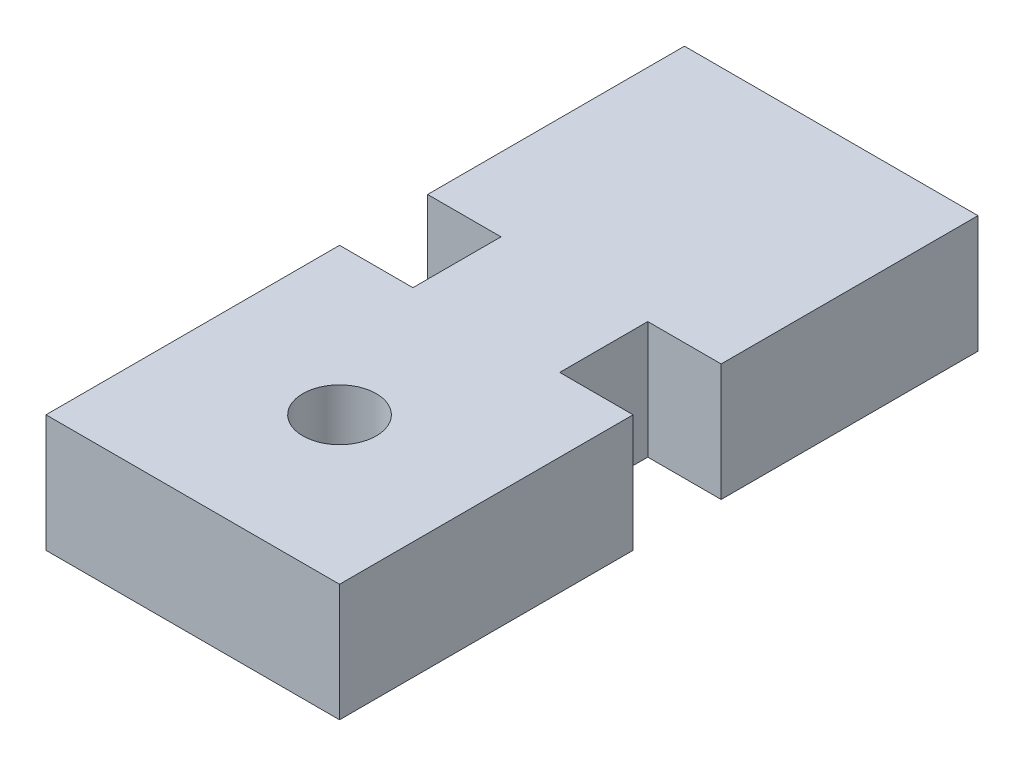
ISO-10303-21;
HEADER;
FILE_DESCRIPTION(('STEP AP214'),'2;1');
FILE_NAME('part.step','',(''),(''),'','','');
FILE_SCHEMA(('AUTOMOTIVE_DESIGN { 1 0 10303 214 1 1 1 1 }'));
ENDSEC;
DATA;
#1=APPLICATION_CONTEXT('core data for automotive mechanical design processes');
#2=APPLICATION_PROTOCOL_DEFINITION('international standard','automotive_design',2000,#1);
#3=PRODUCT_CONTEXT('',#1,'mechanical');
#4=PRODUCT('Part','Part','',(#3));
#5=PRODUCT_RELATED_PRODUCT_CATEGORY('part','',(#4));
#6=PRODUCT_DEFINITION_FORMATION('','',#4);
#7=PRODUCT_DEFINITION_CONTEXT('part definition',#1,'design');
#8=PRODUCT_DEFINITION('design','',#6,#7);
#9=PRODUCT_DEFINITION_SHAPE('','',#8);
#10=(LENGTH_UNIT() NAMED_UNIT(*) SI_UNIT(.MILLI.,.METRE.));
#11=(NAMED_UNIT(*) PLANE_ANGLE_UNIT() SI_UNIT($,.RADIAN.));
#12=(NAMED_UNIT(*) SI_UNIT($,.STERADIAN.) SOLID_ANGLE_UNIT());
#13=UNCERTAINTY_MEASURE_WITH_UNIT(LENGTH_MEASURE(1.E-05),#10,'distance_accuracy_value','');
#14=(GEOMETRIC_REPRESENTATION_CONTEXT(3) GLOBAL_UNCERTAINTY_ASSIGNED_CONTEXT((#13)) GLOBAL_UNIT_ASSIGNED_CONTEXT((#10,
#11,#12)) REPRESENTATION_CONTEXT('',''));
#15=CARTESIAN_POINT('',(0.,0.,0.));
#16=DIRECTION('',(0.,0.,1.));
#17=DIRECTION('',(1.,0.,0.));
#18=AXIS2_PLACEMENT_3D('',#15,#16,#17);
#19=CARTESIAN_POINT('',(-5.,2.,-5.));
#20=DIRECTION('',(0.,0.,1.));
#21=DIRECTION('',(1.,0.,0.));
#22=AXIS2_PLACEMENT_3D('',#19,#20,#21);
#23=PLANE('',#22);
#24=DIRECTION('',(0.,-1.,0.));
#25=VECTOR('',#24,1.);
#26=CARTESIAN_POINT('',(2.5,2.,-5.));
#27=LINE('',#26,#25);
#28=CARTESIAN_POINT('',(2.5,2.,-5.));
#29=VERTEX_POINT('',#28);
#30=CARTESIAN_POINT('',(2.5,-2.,-5.));
#31=VERTEX_POINT('',#30);
#32=EDGE_CURVE('E177',#29,#31,#27,.T.);
#33=ORIENTED_EDGE('',*,*,#32,.F.);
#34=DIRECTION('',(-1.,0.,0.));
#35=VECTOR('',#34,1.);
#36=CARTESIAN_POINT('',(-5.,2.,-5.));
#37=LINE('',#36,#35);
#38=CARTESIAN_POINT('',(5.,2.,-5.));
#39=VERTEX_POINT('',#38);
#40=EDGE_CURVE('E194',#39,#29,#37,.T.);
#41=ORIENTED_EDGE('',*,*,#40,.F.);
#42=DIRECTION('',(0.,-1.,0.));
#43=VECTOR('',#42,1.);
#44=CARTESIAN_POINT('',(5.,2.,-5.));
#45=LINE('',#44,#43);
#46=CARTESIAN_POINT('',(5.,-2.,-5.));
#47=VERTEX_POINT('',#46);
#48=EDGE_CURVE('E207',#39,#47,#45,.T.);
#49=ORIENTED_EDGE('',*,*,#48,.T.);
#50=DIRECTION('',(-1.,0.,0.));
#51=VECTOR('',#50,1.);
#52=CARTESIAN_POINT('',(-5.,-2.,-5.));
#53=LINE('',#52,#51);
#54=EDGE_CURVE('E190',#47,#31,#53,.T.);
#55=ORIENTED_EDGE('',*,*,#54,.T.);
#56=EDGE_LOOP('',(#33,#41,#49,#55));
#57=FACE_BOUND('',#56,.T.);
#58=ADVANCED_FACE('F35',(#57),#23,.F.);
#59=CARTESIAN_POINT('',(0.,2.,0.));
#60=DIRECTION('',(0.,1.,0.));
#61=DIRECTION('',(0.,0.,1.));
#62=AXIS2_PLACEMENT_3D('',#59,#60,#61);
#63=PLANE('',#62);
#64=DIRECTION('',(0.,0.,1.));
#65=VECTOR('',#64,1.);
#66=CARTESIAN_POINT('',(-5.,2.,-5.));
#67=LINE('',#66,#65);
#68=CARTESIAN_POINT('',(-5.,2.,-5.));
#69=VERTEX_POINT('',#68);
#70=CARTESIAN_POINT('',(-5.,2.,5.));
#71=VERTEX_POINT('',#70);
#72=EDGE_CURVE('E188',#69,#71,#67,.T.);
#73=ORIENTED_EDGE('',*,*,#72,.T.);
#74=DIRECTION('',(1.,0.,0.));
#75=VECTOR('',#74,1.);
#76=CARTESIAN_POINT('',(-5.,2.,5.));
#77=LINE('',#76,#75);
#78=CARTESIAN_POINT('',(5.,2.,5.));
#79=VERTEX_POINT('',#78);
#80=EDGE_CURVE('E87',#71,#79,#77,.T.);
#81=ORIENTED_EDGE('',*,*,#80,.T.);
#82=DIRECTION('',(0.,0.,-1.));
#83=VECTOR('',#82,1.);
#84=CARTESIAN_POINT('',(5.,2.,-5.));
#85=LINE('',#84,#83);
#86=EDGE_CURVE('E192',#79,#39,#85,.T.);
#87=ORIENTED_EDGE('',*,*,#86,.T.);
#88=ORIENTED_EDGE('',*,*,#40,.T.);
#89=DIRECTION('',(0.,0.,-1.));
#90=VECTOR('',#89,1.);
#91=CARTESIAN_POINT('',(2.5,2.,-5.));
#92=LINE('',#91,#90);
#93=CARTESIAN_POINT('',(2.5,2.,-8.));
#94=VERTEX_POINT('',#93);
#95=EDGE_CURVE('E170',#29,#94,#92,.T.);
#96=ORIENTED_EDGE('',*,*,#95,.T.);
#97=DIRECTION('',(1.,0.,0.));
#98=VECTOR('',#97,1.);
#99=CARTESIAN_POINT('',(-5.,2.,-8.));
#100=LINE('',#99,#98);
#101=CARTESIAN_POINT('',(5.,2.,-8.));
#102=VERTEX_POINT('',#101);
#103=EDGE_CURVE('E143',#94,#102,#100,.T.);
#104=ORIENTED_EDGE('',*,*,#103,.T.);
#105=DIRECTION('',(0.,0.,-1.));
#106=VECTOR('',#105,1.);
#107=CARTESIAN_POINT('',(5.,2.,-16.75));
#108=LINE('',#107,#106);
#109=CARTESIAN_POINT('',(5.,2.,-16.75));
#110=VERTEX_POINT('',#109);
#111=EDGE_CURVE('E142',#102,#110,#108,.T.);
#112=ORIENTED_EDGE('',*,*,#111,.T.);
#113=DIRECTION('',(-1.,0.,0.));
#114=VECTOR('',#113,1.);
#115=CARTESIAN_POINT('',(-5.,2.,-16.75));
#116=LINE('',#115,#114);
#117=CARTESIAN_POINT('',(-5.,2.,-16.75));
#118=VERTEX_POINT('',#117);
#119=EDGE_CURVE('E150',#110,#118,#116,.T.);
#120=ORIENTED_EDGE('',*,*,#119,.T.);
#121=DIRECTION('',(0.,0.,1.));
#122=VECTOR('',#121,1.);
#123=CARTESIAN_POINT('',(-5.,2.,-16.75));
#124=LINE('',#123,#122);
#125=CARTESIAN_POINT('',(-5.,2.,-8.));
#126=VERTEX_POINT('',#125);
#127=EDGE_CURVE('E146',#118,#126,#124,.T.);
#128=ORIENTED_EDGE('',*,*,#127,.T.);
#129=CARTESIAN_POINT('',(-2.5,2.,-8.));
#130=VERTEX_POINT('',#129);
#131=EDGE_CURVE('E134',#126,#130,#100,.T.);
#132=ORIENTED_EDGE('',*,*,#131,.T.);
#133=DIRECTION('',(0.,0.,1.));
#134=VECTOR('',#133,1.);
#135=CARTESIAN_POINT('',(-2.5,2.,-5.));
#136=LINE('',#135,#134);
#137=CARTESIAN_POINT('',(-2.5,2.,-5.));
#138=VERTEX_POINT('',#137);
#139=EDGE_CURVE('E168',#130,#138,#136,.T.);
#140=ORIENTED_EDGE('',*,*,#139,.T.);
#141=EDGE_CURVE('E59',#138,#69,#37,.T.);
#142=ORIENTED_EDGE('',*,*,#141,.T.);
#143=EDGE_LOOP('',(#73,#81,#87,#88,#96,#104,#112,#120,#128,#132,#140,#142));
#144=FACE_BOUND('',#143,.T.);
#145=CARTESIAN_POINT('',(0.,2.,0.));
#146=DIRECTION('',(0.,1.,0.));
#147=DIRECTION('',(0.,0.,1.));
#148=AXIS2_PLACEMENT_3D('',#145,#146,#147);
#149=CIRCLE('',#148,1.25);
#150=CARTESIAN_POINT('',(0.,2.,1.25));
#151=VERTEX_POINT('',#150);
#152=EDGE_CURVE('E182',#151,#151,#149,.T.);
#153=ORIENTED_EDGE('',*,*,#152,.F.);
#154=EDGE_LOOP('',(#153));
#155=FACE_BOUND('',#154,.T.);
#156=ADVANCED_FACE('F147',(#144,#155),#63,.T.);
#157=CARTESIAN_POINT('',(0.,-2.,0.));
#158=DIRECTION('',(0.,1.,0.));
#159=DIRECTION('',(0.,0.,1.));
#160=AXIS2_PLACEMENT_3D('',#157,#158,#159);
#161=PLANE('',#160);
#162=DIRECTION('',(0.,0.,1.));
#163=VECTOR('',#162,1.);
#164=CARTESIAN_POINT('',(-5.,-2.,-5.));
#165=LINE('',#164,#163);
#166=CARTESIAN_POINT('',(-5.,-2.,-5.));
#167=VERTEX_POINT('',#166);
#168=CARTESIAN_POINT('',(-5.,-2.,5.));
#169=VERTEX_POINT('',#168);
#170=EDGE_CURVE('E185',#167,#169,#165,.T.);
#171=ORIENTED_EDGE('',*,*,#170,.F.);
#172=CARTESIAN_POINT('',(-2.5,-2.,-5.));
#173=VERTEX_POINT('',#172);
#174=EDGE_CURVE('E80',#173,#167,#53,.T.);
#175=ORIENTED_EDGE('',*,*,#174,.F.);
#176=DIRECTION('',(0.,0.,1.));
#177=VECTOR('',#176,1.);
#178=CARTESIAN_POINT('',(-2.5,-2.,-5.));
#179=LINE('',#178,#177);
#180=CARTESIAN_POINT('',(-2.5,-2.,-8.));
#181=VERTEX_POINT('',#180);
#182=EDGE_CURVE('E50',#181,#173,#179,.T.);
#183=ORIENTED_EDGE('',*,*,#182,.F.);
#184=DIRECTION('',(1.,0.,0.));
#185=VECTOR('',#184,1.);
#186=CARTESIAN_POINT('',(-5.,-2.,-8.));
#187=LINE('',#186,#185);
#188=CARTESIAN_POINT('',(-5.,-2.,-8.));
#189=VERTEX_POINT('',#188);
#190=EDGE_CURVE('E252',#189,#181,#187,.T.);
#191=ORIENTED_EDGE('',*,*,#190,.F.);
#192=DIRECTION('',(0.,0.,1.));
#193=VECTOR('',#192,1.);
#194=CARTESIAN_POINT('',(-5.,-2.,-16.75));
#195=LINE('',#194,#193);
#196=CARTESIAN_POINT('',(-5.,-2.,-16.75));
#197=VERTEX_POINT('',#196);
#198=EDGE_CURVE('E158',#197,#189,#195,.T.);
#199=ORIENTED_EDGE('',*,*,#198,.F.);
#200=DIRECTION('',(-1.,0.,0.));
#201=VECTOR('',#200,1.);
#202=CARTESIAN_POINT('',(-5.,-2.,-16.75));
#203=LINE('',#202,#201);
#204=CARTESIAN_POINT('',(5.,-2.,-16.75));
#205=VERTEX_POINT('',#204);
#206=EDGE_CURVE('E154',#205,#197,#203,.T.);
#207=ORIENTED_EDGE('',*,*,#206,.F.);
#208=DIRECTION('',(0.,0.,-1.));
#209=VECTOR('',#208,1.);
#210=CARTESIAN_POINT('',(5.,-2.,-16.75));
#211=LINE('',#210,#209);
#212=CARTESIAN_POINT('',(5.,-2.,-8.));
#213=VERTEX_POINT('',#212);
#214=EDGE_CURVE('E253',#213,#205,#211,.T.);
#215=ORIENTED_EDGE('',*,*,#214,.F.);
#216=CARTESIAN_POINT('',(2.5,-2.,-8.));
#217=VERTEX_POINT('',#216);
#218=EDGE_CURVE('E254',#217,#213,#187,.T.);
#219=ORIENTED_EDGE('',*,*,#218,.F.);
#220=DIRECTION('',(0.,0.,-1.));
#221=VECTOR('',#220,1.);
#222=CARTESIAN_POINT('',(2.5,-2.,-5.));
#223=LINE('',#222,#221);
#224=EDGE_CURVE('E161',#31,#217,#223,.T.);
#225=ORIENTED_EDGE('',*,*,#224,.F.);
#226=ORIENTED_EDGE('',*,*,#54,.F.);
#227=DIRECTION('',(0.,0.,-1.));
#228=VECTOR('',#227,1.);
#229=CARTESIAN_POINT('',(5.,-2.,-5.));
#230=LINE('',#229,#228);
#231=CARTESIAN_POINT('',(5.,-2.,5.));
#232=VERTEX_POINT('',#231);
#233=EDGE_CURVE('E202',#232,#47,#230,.T.);
#234=ORIENTED_EDGE('',*,*,#233,.F.);
#235=DIRECTION('',(1.,0.,0.));
#236=VECTOR('',#235,1.);
#237=CARTESIAN_POINT('',(-5.,-2.,5.));
#238=LINE('',#237,#236);
#239=EDGE_CURVE('E200',#169,#232,#238,.T.);
#240=ORIENTED_EDGE('',*,*,#239,.F.);
#241=EDGE_LOOP('',(#171,#175,#183,#191,#199,#207,#215,#219,#225,#226,#234,#240));
#242=FACE_BOUND('',#241,.T.);
#243=CARTESIAN_POINT('',(0.,-2.,0.));
#244=DIRECTION('',(0.,1.,0.));
#245=DIRECTION('',(0.,0.,1.));
#246=AXIS2_PLACEMENT_3D('',#243,#244,#245);
#247=CIRCLE('',#246,1.25);
#248=CARTESIAN_POINT('',(0.,-2.,1.25));
#249=VERTEX_POINT('',#248);
#250=EDGE_CURVE('E181',#249,#249,#247,.T.);
#251=ORIENTED_EDGE('',*,*,#250,.T.);
#252=EDGE_LOOP('',(#251));
#253=FACE_BOUND('',#252,.T.);
#254=ADVANCED_FACE('F218',(#242,#253),#161,.F.);
#255=CARTESIAN_POINT('',(-5.,2.,-5.));
#256=DIRECTION('',(1.,0.,0.));
#257=DIRECTION('',(0.,0.,-1.));
#258=AXIS2_PLACEMENT_3D('',#255,#256,#257);
#259=PLANE('',#258);
#260=ORIENTED_EDGE('',*,*,#170,.T.);
#261=DIRECTION('',(0.,-1.,0.));
#262=VECTOR('',#261,1.);
#263=CARTESIAN_POINT('',(-5.,2.,5.));
#264=LINE('',#263,#262);
#265=EDGE_CURVE('E11',#71,#169,#264,.T.);
#266=ORIENTED_EDGE('',*,*,#265,.F.);
#267=ORIENTED_EDGE('',*,*,#72,.F.);
#268=DIRECTION('',(0.,-1.,0.));
#269=VECTOR('',#268,1.);
#270=CARTESIAN_POINT('',(-5.,2.,-5.));
#271=LINE('',#270,#269);
#272=EDGE_CURVE('E197',#69,#167,#271,.T.);
#273=ORIENTED_EDGE('',*,*,#272,.T.);
#274=EDGE_LOOP('',(#260,#266,#267,#273));
#275=FACE_BOUND('',#274,.T.);
#276=ADVANCED_FACE('F37',(#275),#259,.F.);
#277=CARTESIAN_POINT('',(-5.,2.,5.));
#278=DIRECTION('',(0.,0.,-1.));
#279=DIRECTION('',(-1.,0.,0.));
#280=AXIS2_PLACEMENT_3D('',#277,#278,#279);
#281=PLANE('',#280);
#282=ORIENTED_EDGE('',*,*,#239,.T.);
#283=DIRECTION('',(0.,-1.,0.));
#284=VECTOR('',#283,1.);
#285=CARTESIAN_POINT('',(5.,2.,5.));
#286=LINE('',#285,#284);
#287=EDGE_CURVE('E43',#79,#232,#286,.T.);
#288=ORIENTED_EDGE('',*,*,#287,.F.);
#289=ORIENTED_EDGE('',*,*,#80,.F.);
#290=ORIENTED_EDGE('',*,*,#265,.T.);
#291=EDGE_LOOP('',(#282,#288,#289,#290));
#292=FACE_BOUND('',#291,.T.);
#293=ADVANCED_FACE('F229',(#292),#281,.F.);
#294=CARTESIAN_POINT('',(5.,2.,-5.));
#295=DIRECTION('',(-1.,0.,0.));
#296=DIRECTION('',(0.,0.,1.));
#297=AXIS2_PLACEMENT_3D('',#294,#295,#296);
#298=PLANE('',#297);
#299=ORIENTED_EDGE('',*,*,#233,.T.);
#300=ORIENTED_EDGE('',*,*,#48,.F.);
#301=ORIENTED_EDGE('',*,*,#86,.F.);
#302=ORIENTED_EDGE('',*,*,#287,.T.);
#303=EDGE_LOOP('',(#299,#300,#301,#302));
#304=FACE_BOUND('',#303,.T.);
#305=ADVANCED_FACE('F213',(#304),#298,.F.);
#306=ORIENTED_EDGE('',*,*,#141,.F.);
#307=DIRECTION('',(0.,-1.,0.));
#308=VECTOR('',#307,1.);
#309=CARTESIAN_POINT('',(-2.5,2.,-5.));
#310=LINE('',#309,#308);
#311=EDGE_CURVE('E179',#138,#173,#310,.T.);
#312=ORIENTED_EDGE('',*,*,#311,.T.);
#313=ORIENTED_EDGE('',*,*,#174,.T.);
#314=ORIENTED_EDGE('',*,*,#272,.F.);
#315=EDGE_LOOP('',(#306,#312,#313,#314));
#316=FACE_BOUND('',#315,.T.);
#317=ADVANCED_FACE('F235',(#316),#23,.F.);
#318=CARTESIAN_POINT('',(0.,2.,0.));
#319=DIRECTION('',(0.,-1.,0.));
#320=DIRECTION('',(0.,0.,-1.));
#321=AXIS2_PLACEMENT_3D('',#318,#319,#320);
#322=CYLINDRICAL_SURFACE('',#321,1.25);
#323=ORIENTED_EDGE('',*,*,#152,.T.);
#324=EDGE_LOOP('',(#323));
#325=FACE_BOUND('',#324,.T.);
#326=ORIENTED_EDGE('',*,*,#250,.F.);
#327=EDGE_LOOP('',(#326));
#328=FACE_BOUND('',#327,.T.);
#329=ADVANCED_FACE('F245',(#325,#328),#322,.F.);
#330=CARTESIAN_POINT('',(-2.5,2.,-5.));
#331=DIRECTION('',(1.,0.,0.));
#332=DIRECTION('',(0.,0.,-1.));
#333=AXIS2_PLACEMENT_3D('',#330,#331,#332);
#334=PLANE('',#333);
#335=ORIENTED_EDGE('',*,*,#182,.T.);
#336=ORIENTED_EDGE('',*,*,#311,.F.);
#337=ORIENTED_EDGE('',*,*,#139,.F.);
#338=DIRECTION('',(0.,-1.,0.));
#339=VECTOR('',#338,1.);
#340=CARTESIAN_POINT('',(-2.5,2.,-8.));
#341=LINE('',#340,#339);
#342=EDGE_CURVE('E141',#130,#181,#341,.T.);
#343=ORIENTED_EDGE('',*,*,#342,.T.);
#344=EDGE_LOOP('',(#335,#336,#337,#343));
#345=FACE_BOUND('',#344,.T.);
#346=ADVANCED_FACE('F249',(#345),#334,.F.);
#347=CARTESIAN_POINT('',(2.5,2.,-5.));
#348=DIRECTION('',(-1.,0.,0.));
#349=DIRECTION('',(0.,0.,1.));
#350=AXIS2_PLACEMENT_3D('',#347,#348,#349);
#351=PLANE('',#350);
#352=ORIENTED_EDGE('',*,*,#224,.T.);
#353=DIRECTION('',(0.,-1.,0.));
#354=VECTOR('',#353,1.);
#355=CARTESIAN_POINT('',(2.5,2.,-8.));
#356=LINE('',#355,#354);
#357=EDGE_CURVE('E174',#94,#217,#356,.T.);
#358=ORIENTED_EDGE('',*,*,#357,.F.);
#359=ORIENTED_EDGE('',*,*,#95,.F.);
#360=ORIENTED_EDGE('',*,*,#32,.T.);
#361=EDGE_LOOP('',(#352,#358,#359,#360));
#362=FACE_BOUND('',#361,.T.);
#363=ADVANCED_FACE('F276',(#362),#351,.F.);
#364=CARTESIAN_POINT('',(-5.,2.,-8.));
#365=DIRECTION('',(0.,0.,-1.));
#366=DIRECTION('',(-1.,0.,0.));
#367=AXIS2_PLACEMENT_3D('',#364,#365,#366);
#368=PLANE('',#367);
#369=ORIENTED_EDGE('',*,*,#103,.F.);
#370=ORIENTED_EDGE('',*,*,#357,.T.);
#371=ORIENTED_EDGE('',*,*,#218,.T.);
#372=DIRECTION('',(0.,-1.,0.));
#373=VECTOR('',#372,1.);
#374=CARTESIAN_POINT('',(5.,2.,-8.));
#375=LINE('',#374,#373);
#376=EDGE_CURVE('E159',#102,#213,#375,.T.);
#377=ORIENTED_EDGE('',*,*,#376,.F.);
#378=EDGE_LOOP('',(#369,#370,#371,#377));
#379=FACE_BOUND('',#378,.T.);
#380=ADVANCED_FACE('F274',(#379),#368,.F.);
#381=CARTESIAN_POINT('',(-5.,2.,-16.75));
#382=DIRECTION('',(1.,0.,0.));
#383=DIRECTION('',(0.,0.,-1.));
#384=AXIS2_PLACEMENT_3D('',#381,#382,#383);
#385=PLANE('',#384);
#386=ORIENTED_EDGE('',*,*,#198,.T.);
#387=DIRECTION('',(0.,-1.,0.));
#388=VECTOR('',#387,1.);
#389=CARTESIAN_POINT('',(-5.,2.,-8.));
#390=LINE('',#389,#388);
#391=EDGE_CURVE('E139',#126,#189,#390,.T.);
#392=ORIENTED_EDGE('',*,*,#391,.F.);
#393=ORIENTED_EDGE('',*,*,#127,.F.);
#394=DIRECTION('',(0.,-1.,0.));
#395=VECTOR('',#394,1.);
#396=CARTESIAN_POINT('',(-5.,2.,-16.75));
#397=LINE('',#396,#395);
#398=EDGE_CURVE('E261',#118,#197,#397,.T.);
#399=ORIENTED_EDGE('',*,*,#398,.T.);
#400=EDGE_LOOP('',(#386,#392,#393,#399));
#401=FACE_BOUND('',#400,.T.);
#402=ADVANCED_FACE('F156',(#401),#385,.F.);
#403=ORIENTED_EDGE('',*,*,#342,.F.);
#404=ORIENTED_EDGE('',*,*,#131,.F.);
#405=ORIENTED_EDGE('',*,*,#391,.T.);
#406=ORIENTED_EDGE('',*,*,#190,.T.);
#407=EDGE_LOOP('',(#403,#404,#405,#406));
#408=FACE_BOUND('',#407,.T.);
#409=ADVANCED_FACE('F136',(#408),#368,.F.);
#410=CARTESIAN_POINT('',(5.,2.,-16.75));
#411=DIRECTION('',(-1.,0.,0.));
#412=DIRECTION('',(0.,0.,1.));
#413=AXIS2_PLACEMENT_3D('',#410,#411,#412);
#414=PLANE('',#413);
#415=ORIENTED_EDGE('',*,*,#214,.T.);
#416=DIRECTION('',(0.,-1.,0.));
#417=VECTOR('',#416,1.);
#418=CARTESIAN_POINT('',(5.,2.,-16.75));
#419=LINE('',#418,#417);
#420=EDGE_CURVE('E164',#110,#205,#419,.T.);
#421=ORIENTED_EDGE('',*,*,#420,.F.);
#422=ORIENTED_EDGE('',*,*,#111,.F.);
#423=ORIENTED_EDGE('',*,*,#376,.T.);
#424=EDGE_LOOP('',(#415,#421,#422,#423));
#425=FACE_BOUND('',#424,.T.);
#426=ADVANCED_FACE('F270',(#425),#414,.F.);
#427=CARTESIAN_POINT('',(-5.,2.,-16.75));
#428=DIRECTION('',(0.,0.,1.));
#429=DIRECTION('',(1.,0.,0.));
#430=AXIS2_PLACEMENT_3D('',#427,#428,#429);
#431=PLANE('',#430);
#432=ORIENTED_EDGE('',*,*,#206,.T.);
#433=ORIENTED_EDGE('',*,*,#398,.F.);
#434=ORIENTED_EDGE('',*,*,#119,.F.);
#435=ORIENTED_EDGE('',*,*,#420,.T.);
#436=EDGE_LOOP('',(#432,#433,#434,#435));
#437=FACE_BOUND('',#436,.T.);
#438=ADVANCED_FACE('F266',(#437),#431,.F.);
#439=CLOSED_SHELL('',(#58,#156,#254,#276,#293,#305,#317,#329,#346,#363,#380,#402,#409,#426,#438));
#440=MANIFOLD_SOLID_BREP('B2',#439);
#441=ADVANCED_BREP_SHAPE_REPRESENTATION('',(#18,#440),#14);
#442=SHAPE_DEFINITION_REPRESENTATION(#9,#441);
ENDSEC;
END-ISO-10303-21;
